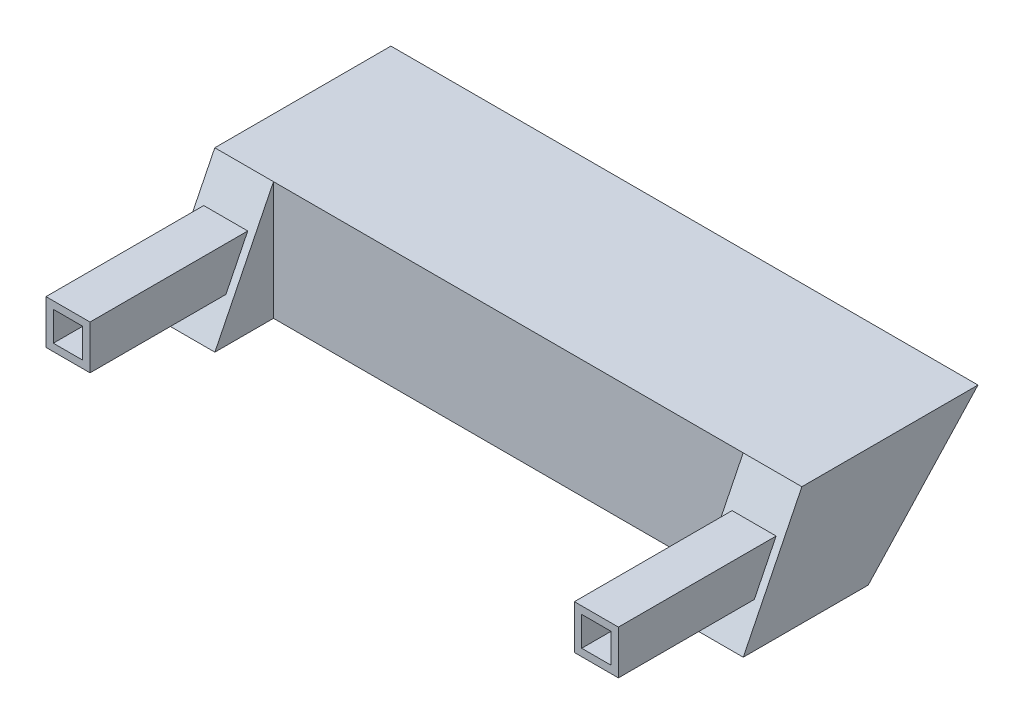
ISO-10303-21;
HEADER;
FILE_DESCRIPTION(('STEP AP214'),'2;1');
FILE_NAME('part.step','',(''),(''),'','','');
FILE_SCHEMA(('AUTOMOTIVE_DESIGN { 1 0 10303 214 1 1 1 1 }'));
ENDSEC;
DATA;
#1=APPLICATION_CONTEXT('core data for automotive mechanical design processes');
#2=APPLICATION_PROTOCOL_DEFINITION('international standard','automotive_design',2000,#1);
#3=PRODUCT_CONTEXT('',#1,'mechanical');
#4=PRODUCT('Part','Part','',(#3));
#5=PRODUCT_RELATED_PRODUCT_CATEGORY('part','',(#4));
#6=PRODUCT_DEFINITION_FORMATION('','',#4);
#7=PRODUCT_DEFINITION_CONTEXT('part definition',#1,'design');
#8=PRODUCT_DEFINITION('design','',#6,#7);
#9=PRODUCT_DEFINITION_SHAPE('','',#8);
#10=(LENGTH_UNIT() NAMED_UNIT(*) SI_UNIT(.MILLI.,.METRE.));
#11=(NAMED_UNIT(*) PLANE_ANGLE_UNIT() SI_UNIT($,.RADIAN.));
#12=(NAMED_UNIT(*) SI_UNIT($,.STERADIAN.) SOLID_ANGLE_UNIT());
#13=UNCERTAINTY_MEASURE_WITH_UNIT(LENGTH_MEASURE(1.E-05),#10,'distance_accuracy_value','');
#14=(GEOMETRIC_REPRESENTATION_CONTEXT(3) GLOBAL_UNCERTAINTY_ASSIGNED_CONTEXT((#13)) GLOBAL_UNIT_ASSIGNED_CONTEXT((#10,
#11,#12)) REPRESENTATION_CONTEXT('',''));
#15=CARTESIAN_POINT('',(0.,0.,0.));
#16=DIRECTION('',(0.,0.,1.));
#17=DIRECTION('',(1.,0.,0.));
#18=AXIS2_PLACEMENT_3D('',#15,#16,#17);
#19=CARTESIAN_POINT('',(127.,51.2148659668265,0.));
#20=DIRECTION('',(0.,-0.443755020837532,-0.896148135902475));
#21=DIRECTION('',(0.,0.896148135902475,-0.443755020837533));
#22=AXIS2_PLACEMENT_3D('',#19,#20,#21);
#23=PLANE('',#22);
#24=DIRECTION('',(0.,-0.896148135902475,0.443755020837532));
#25=VECTOR('',#24,1.);
#26=CARTESIAN_POINT('',(101.6,51.2148659668265,0.));
#27=LINE('',#26,#25);
#28=CARTESIAN_POINT('',(101.6,51.2148659668265,0.));
#29=VERTEX_POINT('',#28);
#30=CARTESIAN_POINT('',(101.6,0.,25.360599440865));
#31=VERTEX_POINT('',#30);
#32=EDGE_CURVE('E361',#29,#31,#27,.T.);
#33=ORIENTED_EDGE('',*,*,#32,.T.);
#34=DIRECTION('',(-1.,0.,0.));
#35=VECTOR('',#34,1.);
#36=CARTESIAN_POINT('',(127.,0.,25.360599440865));
#37=LINE('',#36,#35);
#38=CARTESIAN_POINT('',(127.,0.,25.360599440865));
#39=VERTEX_POINT('',#38);
#40=EDGE_CURVE('E356',#39,#31,#37,.T.);
#41=ORIENTED_EDGE('',*,*,#40,.F.);
#42=DIRECTION('',(0.,-0.896148135902475,0.443755020837532));
#43=VECTOR('',#42,1.);
#44=CARTESIAN_POINT('',(127.,51.2148659668265,0.));
#45=LINE('',#44,#43);
#46=CARTESIAN_POINT('',(127.,51.2148659668265,0.));
#47=VERTEX_POINT('',#46);
#48=EDGE_CURVE('E352',#47,#39,#45,.T.);
#49=ORIENTED_EDGE('',*,*,#48,.F.);
#50=DIRECTION('',(-1.,0.,0.));
#51=VECTOR('',#50,1.);
#52=CARTESIAN_POINT('',(127.,51.2148659668265,0.));
#53=LINE('',#52,#51);
#54=EDGE_CURVE('E395',#47,#29,#53,.T.);
#55=ORIENTED_EDGE('',*,*,#54,.T.);
#56=EDGE_LOOP('',(#33,#41,#49,#55));
#57=FACE_BOUND('',#56,.T.);
#58=DIRECTION('',(0.,-0.896148135902475,0.443755020837533));
#59=VECTOR('',#58,1.);
#60=CARTESIAN_POINT('',(104.775,51.2148659668265,0.));
#61=LINE('',#60,#59);
#62=CARTESIAN_POINT('',(104.775,35.1324329834132,7.96370610812656));
#63=VERTEX_POINT('',#62);
#64=CARTESIAN_POINT('',(104.775,16.0824329834132,17.3968933327384));
#65=VERTEX_POINT('',#64);
#66=EDGE_CURVE('E434',#63,#65,#61,.T.);
#67=ORIENTED_EDGE('',*,*,#66,.F.);
#68=DIRECTION('',(-1.,0.,0.));
#69=VECTOR('',#68,1.);
#70=CARTESIAN_POINT('',(127.,35.1324329834132,7.96370610812653));
#71=LINE('',#70,#69);
#72=CARTESIAN_POINT('',(123.825,35.1324329834132,7.96370610812653));
#73=VERTEX_POINT('',#72);
#74=EDGE_CURVE('E422',#73,#63,#71,.T.);
#75=ORIENTED_EDGE('',*,*,#74,.F.);
#76=DIRECTION('',(0.,0.896148135902475,-0.443755020837533));
#77=VECTOR('',#76,1.);
#78=CARTESIAN_POINT('',(123.825,51.2148659668265,0.));
#79=LINE('',#78,#77);
#80=CARTESIAN_POINT('',(123.825,16.0824329834132,17.3968933327384));
#81=VERTEX_POINT('',#80);
#82=EDGE_CURVE('E426',#81,#73,#79,.T.);
#83=ORIENTED_EDGE('',*,*,#82,.F.);
#84=DIRECTION('',(1.,0.,0.));
#85=VECTOR('',#84,1.);
#86=CARTESIAN_POINT('',(127.,16.0824329834132,17.3968933327384));
#87=LINE('',#86,#85);
#88=EDGE_CURVE('E430',#65,#81,#87,.T.);
#89=ORIENTED_EDGE('',*,*,#88,.F.);
#90=EDGE_LOOP('',(#67,#75,#83,#89));
#91=FACE_BOUND('',#90,.T.);
#92=ADVANCED_FACE('F45',(#57,#91),#23,.F.);
#93=CARTESIAN_POINT('',(127.,0.,0.));
#94=DIRECTION('',(0.,0.,-1.));
#95=DIRECTION('',(-1.,0.,0.));
#96=AXIS2_PLACEMENT_3D('',#93,#94,#95);
#97=PLANE('',#96);
#98=DIRECTION('',(0.,1.,0.));
#99=VECTOR('',#98,1.);
#100=CARTESIAN_POINT('',(-101.6,51.2148659668265,0.));
#101=LINE('',#100,#99);
#102=CARTESIAN_POINT('',(-101.6,0.,0.));
#103=VERTEX_POINT('',#102);
#104=CARTESIAN_POINT('',(-101.6,51.2148659668265,0.));
#105=VERTEX_POINT('',#104);
#106=EDGE_CURVE('E329',#103,#105,#101,.T.);
#107=ORIENTED_EDGE('',*,*,#106,.F.);
#108=DIRECTION('',(-1.,0.,0.));
#109=VECTOR('',#108,1.);
#110=CARTESIAN_POINT('',(127.,0.,0.));
#111=LINE('',#110,#109);
#112=CARTESIAN_POINT('',(101.6,0.,0.));
#113=VERTEX_POINT('',#112);
#114=EDGE_CURVE('E382',#113,#103,#111,.T.);
#115=ORIENTED_EDGE('',*,*,#114,.F.);
#116=DIRECTION('',(0.,1.,0.));
#117=VECTOR('',#116,1.);
#118=CARTESIAN_POINT('',(101.6,51.2148659668265,0.));
#119=LINE('',#118,#117);
#120=EDGE_CURVE('E351',#113,#29,#119,.T.);
#121=ORIENTED_EDGE('',*,*,#120,.T.);
#122=EDGE_CURVE('E394',#29,#105,#53,.T.);
#123=ORIENTED_EDGE('',*,*,#122,.T.);
#124=EDGE_LOOP('',(#107,#115,#121,#123));
#125=FACE_BOUND('',#124,.T.);
#126=ADVANCED_FACE('F485',(#125),#97,.F.);
#127=CARTESIAN_POINT('',(127.,0.,-28.702));
#128=DIRECTION('',(0.,1.,0.));
#129=DIRECTION('',(0.,0.,1.));
#130=AXIS2_PLACEMENT_3D('',#127,#128,#129);
#131=PLANE('',#130);
#132=DIRECTION('',(0.,0.,-1.));
#133=VECTOR('',#132,1.);
#134=CARTESIAN_POINT('',(-127.,0.,-28.702));
#135=LINE('',#134,#133);
#136=CARTESIAN_POINT('',(-127.,0.,25.360599440865));
#137=VERTEX_POINT('',#136);
#138=CARTESIAN_POINT('',(-127.,0.,-28.702));
#139=VERTEX_POINT('',#138);
#140=EDGE_CURVE('E369',#137,#139,#135,.T.);
#141=ORIENTED_EDGE('',*,*,#140,.T.);
#142=DIRECTION('',(-1.,0.,0.));
#143=VECTOR('',#142,1.);
#144=CARTESIAN_POINT('',(127.,0.,-28.702));
#145=LINE('',#144,#143);
#146=CARTESIAN_POINT('',(127.,0.,-28.702));
#147=VERTEX_POINT('',#146);
#148=EDGE_CURVE('E402',#147,#139,#145,.T.);
#149=ORIENTED_EDGE('',*,*,#148,.F.);
#150=DIRECTION('',(0.,0.,-1.));
#151=VECTOR('',#150,1.);
#152=CARTESIAN_POINT('',(127.,0.,-28.702));
#153=LINE('',#152,#151);
#154=EDGE_CURVE('E370',#39,#147,#153,.T.);
#155=ORIENTED_EDGE('',*,*,#154,.F.);
#156=ORIENTED_EDGE('',*,*,#40,.T.);
#157=DIRECTION('',(0.,0.,-1.));
#158=VECTOR('',#157,1.);
#159=CARTESIAN_POINT('',(101.6,0.,25.360599440865));
#160=LINE('',#159,#158);
#161=EDGE_CURVE('E357',#31,#113,#160,.T.);
#162=ORIENTED_EDGE('',*,*,#161,.T.);
#163=ORIENTED_EDGE('',*,*,#114,.T.);
#164=DIRECTION('',(0.,0.,-1.));
#165=VECTOR('',#164,1.);
#166=CARTESIAN_POINT('',(-101.6,0.,25.360599440865));
#167=LINE('',#166,#165);
#168=CARTESIAN_POINT('',(-101.6,0.,25.360599440865));
#169=VERTEX_POINT('',#168);
#170=EDGE_CURVE('E339',#169,#103,#167,.T.);
#171=ORIENTED_EDGE('',*,*,#170,.F.);
#172=DIRECTION('',(1.,0.,0.));
#173=VECTOR('',#172,1.);
#174=CARTESIAN_POINT('',(-127.,0.,25.360599440865));
#175=LINE('',#174,#173);
#176=EDGE_CURVE('E348',#137,#169,#175,.T.);
#177=ORIENTED_EDGE('',*,*,#176,.F.);
#178=EDGE_LOOP('',(#141,#149,#155,#156,#162,#163,#171,#177));
#179=FACE_BOUND('',#178,.T.);
#180=ADVANCED_FACE('F47',(#179),#131,.F.);
#181=CARTESIAN_POINT('',(127.,51.2148659668265,-76.2));
#182=DIRECTION('',(0.,0.68,0.733212111192934));
#183=DIRECTION('',(0.,-0.733212111192934,0.68));
#184=AXIS2_PLACEMENT_3D('',#181,#182,#183);
#185=PLANE('',#184);
#186=DIRECTION('',(0.,0.733212111192934,-0.68));
#187=VECTOR('',#186,1.);
#188=CARTESIAN_POINT('',(-127.,51.2148659668265,-76.2));
#189=LINE('',#188,#187);
#190=CARTESIAN_POINT('',(-127.,51.2148659668265,-76.2));
#191=VERTEX_POINT('',#190);
#192=EDGE_CURVE('E386',#139,#191,#189,.T.);
#193=ORIENTED_EDGE('',*,*,#192,.T.);
#194=DIRECTION('',(-1.,0.,0.));
#195=VECTOR('',#194,1.);
#196=CARTESIAN_POINT('',(127.,51.2148659668265,-76.2));
#197=LINE('',#196,#195);
#198=CARTESIAN_POINT('',(127.,51.2148659668265,-76.2));
#199=VERTEX_POINT('',#198);
#200=EDGE_CURVE('E398',#199,#191,#197,.T.);
#201=ORIENTED_EDGE('',*,*,#200,.F.);
#202=DIRECTION('',(0.,0.733212111192934,-0.68));
#203=VECTOR('',#202,1.);
#204=CARTESIAN_POINT('',(127.,51.2148659668265,-76.2));
#205=LINE('',#204,#203);
#206=EDGE_CURVE('E374',#147,#199,#205,.T.);
#207=ORIENTED_EDGE('',*,*,#206,.F.);
#208=ORIENTED_EDGE('',*,*,#148,.T.);
#209=EDGE_LOOP('',(#193,#201,#207,#208));
#210=FACE_BOUND('',#209,.T.);
#211=ADVANCED_FACE('F504',(#210),#185,.F.);
#212=CARTESIAN_POINT('',(127.,51.2148659668265,0.));
#213=DIRECTION('',(0.,-1.,0.));
#214=DIRECTION('',(0.,0.,-1.));
#215=AXIS2_PLACEMENT_3D('',#212,#213,#214);
#216=PLANE('',#215);
#217=DIRECTION('',(0.,0.,1.));
#218=VECTOR('',#217,1.);
#219=CARTESIAN_POINT('',(-127.,51.2148659668265,0.));
#220=LINE('',#219,#218);
#221=CARTESIAN_POINT('',(-127.,51.2148659668265,0.));
#222=VERTEX_POINT('',#221);
#223=EDGE_CURVE('E375',#191,#222,#220,.T.);
#224=ORIENTED_EDGE('',*,*,#223,.T.);
#225=DIRECTION('',(1.,0.,0.));
#226=VECTOR('',#225,1.);
#227=CARTESIAN_POINT('',(-127.,51.2148659668265,0.));
#228=LINE('',#227,#226);
#229=EDGE_CURVE('E334',#222,#105,#228,.T.);
#230=ORIENTED_EDGE('',*,*,#229,.T.);
#231=ORIENTED_EDGE('',*,*,#122,.F.);
#232=ORIENTED_EDGE('',*,*,#54,.F.);
#233=DIRECTION('',(0.,0.,1.));
#234=VECTOR('',#233,1.);
#235=CARTESIAN_POINT('',(127.,51.2148659668265,0.));
#236=LINE('',#235,#234);
#237=EDGE_CURVE('E378',#199,#47,#236,.T.);
#238=ORIENTED_EDGE('',*,*,#237,.F.);
#239=ORIENTED_EDGE('',*,*,#200,.T.);
#240=EDGE_LOOP('',(#224,#230,#231,#232,#238,#239));
#241=FACE_BOUND('',#240,.T.);
#242=ADVANCED_FACE('F495',(#241),#216,.F.);
#243=CARTESIAN_POINT('',(127.,0.,0.));
#244=DIRECTION('',(-1.,0.,0.));
#245=DIRECTION('',(0.,0.,1.));
#246=AXIS2_PLACEMENT_3D('',#243,#244,#245);
#247=PLANE('',#246);
#248=ORIENTED_EDGE('',*,*,#154,.T.);
#249=ORIENTED_EDGE('',*,*,#206,.T.);
#250=ORIENTED_EDGE('',*,*,#237,.T.);
#251=ORIENTED_EDGE('',*,*,#48,.T.);
#252=EDGE_LOOP('',(#248,#249,#250,#251));
#253=FACE_BOUND('',#252,.T.);
#254=ADVANCED_FACE('F506',(#253),#247,.F.);
#255=CARTESIAN_POINT('',(-127.,0.,0.));
#256=DIRECTION('',(-1.,0.,0.));
#257=DIRECTION('',(0.,0.,1.));
#258=AXIS2_PLACEMENT_3D('',#255,#256,#257);
#259=PLANE('',#258);
#260=ORIENTED_EDGE('',*,*,#140,.F.);
#261=DIRECTION('',(0.,-0.896148135902475,0.443755020837532));
#262=VECTOR('',#261,1.);
#263=CARTESIAN_POINT('',(-127.,51.2148659668265,0.));
#264=LINE('',#263,#262);
#265=EDGE_CURVE('E330',#222,#137,#264,.T.);
#266=ORIENTED_EDGE('',*,*,#265,.F.);
#267=ORIENTED_EDGE('',*,*,#223,.F.);
#268=ORIENTED_EDGE('',*,*,#192,.F.);
#269=EDGE_LOOP('',(#260,#266,#267,#268));
#270=FACE_BOUND('',#269,.T.);
#271=ADVANCED_FACE('F501',(#270),#259,.T.);
#272=CARTESIAN_POINT('',(101.6,0.,0.));
#273=DIRECTION('',(1.,0.,0.));
#274=DIRECTION('',(0.,0.,-1.));
#275=AXIS2_PLACEMENT_3D('',#272,#273,#274);
#276=PLANE('',#275);
#277=ORIENTED_EDGE('',*,*,#120,.F.);
#278=ORIENTED_EDGE('',*,*,#161,.F.);
#279=ORIENTED_EDGE('',*,*,#32,.F.);
#280=EDGE_LOOP('',(#277,#278,#279));
#281=FACE_BOUND('',#280,.T.);
#282=ADVANCED_FACE('F473',(#281),#276,.F.);
#283=CARTESIAN_POINT('',(-127.,51.2148659668265,0.));
#284=DIRECTION('',(0.,0.443755020837532,0.896148135902475));
#285=DIRECTION('',(0.,-0.896148135902475,0.443755020837533));
#286=AXIS2_PLACEMENT_3D('',#283,#284,#285);
#287=PLANE('',#286);
#288=DIRECTION('',(0.,0.896148135902475,-0.443755020837533));
#289=VECTOR('',#288,1.);
#290=CARTESIAN_POINT('',(-104.775,51.2148659668265,0.));
#291=LINE('',#290,#289);
#292=CARTESIAN_POINT('',(-104.775,16.0824329834132,17.3968933327384));
#293=VERTEX_POINT('',#292);
#294=CARTESIAN_POINT('',(-104.775,35.1324329834132,7.96370610812653));
#295=VERTEX_POINT('',#294);
#296=EDGE_CURVE('E11',#293,#295,#291,.T.);
#297=ORIENTED_EDGE('',*,*,#296,.F.);
#298=DIRECTION('',(1.,0.,0.));
#299=VECTOR('',#298,1.);
#300=CARTESIAN_POINT('',(-127.,16.0824329834132,17.3968933327384));
#301=LINE('',#300,#299);
#302=CARTESIAN_POINT('',(-123.825,16.0824329834132,17.3968933327384));
#303=VERTEX_POINT('',#302);
#304=EDGE_CURVE('E451',#303,#293,#301,.T.);
#305=ORIENTED_EDGE('',*,*,#304,.F.);
#306=DIRECTION('',(0.,-0.896148135902475,0.443755020837533));
#307=VECTOR('',#306,1.);
#308=CARTESIAN_POINT('',(-123.825,51.2148659668265,0.));
#309=LINE('',#308,#307);
#310=CARTESIAN_POINT('',(-123.825,35.1324329834132,7.96370610812653));
#311=VERTEX_POINT('',#310);
#312=EDGE_CURVE('E64',#311,#303,#309,.T.);
#313=ORIENTED_EDGE('',*,*,#312,.F.);
#314=DIRECTION('',(-1.,0.,0.));
#315=VECTOR('',#314,1.);
#316=CARTESIAN_POINT('',(-127.,35.1324329834132,7.96370610812653));
#317=LINE('',#316,#315);
#318=EDGE_CURVE('E54',#295,#311,#317,.T.);
#319=ORIENTED_EDGE('',*,*,#318,.F.);
#320=EDGE_LOOP('',(#297,#305,#313,#319));
#321=FACE_BOUND('',#320,.T.);
#322=DIRECTION('',(0.,-0.896148135902475,0.443755020837532));
#323=VECTOR('',#322,1.);
#324=CARTESIAN_POINT('',(-101.6,51.2148659668265,0.));
#325=LINE('',#324,#323);
#326=EDGE_CURVE('E335',#105,#169,#325,.T.);
#327=ORIENTED_EDGE('',*,*,#326,.F.);
#328=ORIENTED_EDGE('',*,*,#229,.F.);
#329=ORIENTED_EDGE('',*,*,#265,.T.);
#330=ORIENTED_EDGE('',*,*,#176,.T.);
#331=EDGE_LOOP('',(#327,#328,#329,#330));
#332=FACE_BOUND('',#331,.T.);
#333=ADVANCED_FACE('F469',(#321,#332),#287,.T.);
#334=CARTESIAN_POINT('',(-101.6,0.,0.));
#335=DIRECTION('',(-1.,0.,0.));
#336=DIRECTION('',(0.,0.,-1.));
#337=AXIS2_PLACEMENT_3D('',#334,#335,#336);
#338=PLANE('',#337);
#339=ORIENTED_EDGE('',*,*,#106,.T.);
#340=ORIENTED_EDGE('',*,*,#326,.T.);
#341=ORIENTED_EDGE('',*,*,#170,.T.);
#342=EDGE_LOOP('',(#339,#340,#341));
#343=FACE_BOUND('',#342,.T.);
#344=ADVANCED_FACE('F472',(#343),#338,.F.);
#345=CARTESIAN_POINT('',(104.775,35.1324329834132,76.2));
#346=DIRECTION('',(1.,0.,0.));
#347=DIRECTION('',(0.,0.,-1.));
#348=AXIS2_PLACEMENT_3D('',#345,#346,#347);
#349=PLANE('',#348);
#350=DIRECTION('',(0.,0.,-1.));
#351=VECTOR('',#350,1.);
#352=CARTESIAN_POINT('',(104.775,35.1324329834132,76.2));
#353=LINE('',#352,#351);
#354=CARTESIAN_POINT('',(104.775,35.1324329834132,76.2));
#355=VERTEX_POINT('',#354);
#356=EDGE_CURVE('E313',#355,#63,#353,.T.);
#357=ORIENTED_EDGE('',*,*,#356,.T.);
#358=ORIENTED_EDGE('',*,*,#66,.T.);
#359=DIRECTION('',(0.,0.,-1.));
#360=VECTOR('',#359,1.);
#361=CARTESIAN_POINT('',(104.775,16.0824329834132,76.2));
#362=LINE('',#361,#360);
#363=CARTESIAN_POINT('',(104.775,16.0824329834132,76.2));
#364=VERTEX_POINT('',#363);
#365=EDGE_CURVE('E325',#364,#65,#362,.T.);
#366=ORIENTED_EDGE('',*,*,#365,.F.);
#367=DIRECTION('',(0.,-1.,0.));
#368=VECTOR('',#367,1.);
#369=CARTESIAN_POINT('',(104.775,35.1324329834132,76.2));
#370=LINE('',#369,#368);
#371=EDGE_CURVE('E300',#355,#364,#370,.T.);
#372=ORIENTED_EDGE('',*,*,#371,.F.);
#373=EDGE_LOOP('',(#357,#358,#366,#372));
#374=FACE_BOUND('',#373,.T.);
#375=ADVANCED_FACE('F520',(#374),#349,.F.);
#376=CARTESIAN_POINT('',(104.775,16.0824329834132,76.2));
#377=DIRECTION('',(0.,1.,0.));
#378=DIRECTION('',(0.,0.,1.));
#379=AXIS2_PLACEMENT_3D('',#376,#377,#378);
#380=PLANE('',#379);
#381=ORIENTED_EDGE('',*,*,#365,.T.);
#382=ORIENTED_EDGE('',*,*,#88,.T.);
#383=DIRECTION('',(0.,0.,-1.));
#384=VECTOR('',#383,1.);
#385=CARTESIAN_POINT('',(123.825,16.0824329834132,76.2));
#386=LINE('',#385,#384);
#387=CARTESIAN_POINT('',(123.825,16.0824329834132,76.2));
#388=VERTEX_POINT('',#387);
#389=EDGE_CURVE('E321',#388,#81,#386,.T.);
#390=ORIENTED_EDGE('',*,*,#389,.F.);
#391=DIRECTION('',(1.,0.,0.));
#392=VECTOR('',#391,1.);
#393=CARTESIAN_POINT('',(104.775,16.0824329834132,76.2));
#394=LINE('',#393,#392);
#395=EDGE_CURVE('E304',#364,#388,#394,.T.);
#396=ORIENTED_EDGE('',*,*,#395,.F.);
#397=EDGE_LOOP('',(#381,#382,#390,#396));
#398=FACE_BOUND('',#397,.T.);
#399=ADVANCED_FACE('F529',(#398),#380,.F.);
#400=CARTESIAN_POINT('',(123.825,35.1324329834132,76.2));
#401=DIRECTION('',(-1.,0.,0.));
#402=DIRECTION('',(0.,0.,1.));
#403=AXIS2_PLACEMENT_3D('',#400,#401,#402);
#404=PLANE('',#403);
#405=ORIENTED_EDGE('',*,*,#389,.T.);
#406=ORIENTED_EDGE('',*,*,#82,.T.);
#407=DIRECTION('',(0.,0.,-1.));
#408=VECTOR('',#407,1.);
#409=CARTESIAN_POINT('',(123.825,35.1324329834132,76.2));
#410=LINE('',#409,#408);
#411=CARTESIAN_POINT('',(123.825,35.1324329834132,76.2));
#412=VERTEX_POINT('',#411);
#413=EDGE_CURVE('E317',#412,#73,#410,.T.);
#414=ORIENTED_EDGE('',*,*,#413,.F.);
#415=DIRECTION('',(0.,1.,0.));
#416=VECTOR('',#415,1.);
#417=CARTESIAN_POINT('',(123.825,35.1324329834132,76.2));
#418=LINE('',#417,#416);
#419=EDGE_CURVE('E307',#388,#412,#418,.T.);
#420=ORIENTED_EDGE('',*,*,#419,.F.);
#421=EDGE_LOOP('',(#405,#406,#414,#420));
#422=FACE_BOUND('',#421,.T.);
#423=ADVANCED_FACE('F527',(#422),#404,.F.);
#424=CARTESIAN_POINT('',(104.775,35.1324329834132,76.2));
#425=DIRECTION('',(0.,-1.,0.));
#426=DIRECTION('',(0.,0.,-1.));
#427=AXIS2_PLACEMENT_3D('',#424,#425,#426);
#428=PLANE('',#427);
#429=ORIENTED_EDGE('',*,*,#413,.T.);
#430=ORIENTED_EDGE('',*,*,#74,.T.);
#431=ORIENTED_EDGE('',*,*,#356,.F.);
#432=DIRECTION('',(-1.,0.,0.));
#433=VECTOR('',#432,1.);
#434=CARTESIAN_POINT('',(104.775,35.1324329834132,76.2));
#435=LINE('',#434,#433);
#436=EDGE_CURVE('E310',#412,#355,#435,.T.);
#437=ORIENTED_EDGE('',*,*,#436,.F.);
#438=EDGE_LOOP('',(#429,#430,#431,#437));
#439=FACE_BOUND('',#438,.T.);
#440=ADVANCED_FACE('F516',(#439),#428,.F.);
#441=CARTESIAN_POINT('',(107.95,31.9574329834132,76.2));
#442=DIRECTION('',(1.,0.,0.));
#443=DIRECTION('',(0.,0.,-1.));
#444=AXIS2_PLACEMENT_3D('',#441,#442,#443);
#445=PLANE('',#444);
#446=DIRECTION('',(0.,-0.896148135902475,0.443755020837533));
#447=VECTOR('',#446,1.);
#448=CARTESIAN_POINT('',(107.95,51.2148659668265,0.));
#449=LINE('',#448,#447);
#450=CARTESIAN_POINT('',(107.95,31.9574329834132,9.53590397889518));
#451=VERTEX_POINT('',#450);
#452=CARTESIAN_POINT('',(107.95,19.2574329834132,15.8246954619698));
#453=VERTEX_POINT('',#452);
#454=EDGE_CURVE('E418',#451,#453,#449,.T.);
#455=ORIENTED_EDGE('',*,*,#454,.F.);
#456=DIRECTION('',(0.,0.,-1.));
#457=VECTOR('',#456,1.);
#458=CARTESIAN_POINT('',(107.95,31.9574329834132,76.2));
#459=LINE('',#458,#457);
#460=CARTESIAN_POINT('',(107.95,31.9574329834132,76.2));
#461=VERTEX_POINT('',#460);
#462=EDGE_CURVE('E285',#461,#451,#459,.T.);
#463=ORIENTED_EDGE('',*,*,#462,.F.);
#464=DIRECTION('',(0.,-1.,0.));
#465=VECTOR('',#464,1.);
#466=CARTESIAN_POINT('',(107.95,31.9574329834132,76.2));
#467=LINE('',#466,#465);
#468=CARTESIAN_POINT('',(107.95,19.2574329834132,76.2));
#469=VERTEX_POINT('',#468);
#470=EDGE_CURVE('E272',#461,#469,#467,.T.);
#471=ORIENTED_EDGE('',*,*,#470,.T.);
#472=DIRECTION('',(0.,0.,-1.));
#473=VECTOR('',#472,1.);
#474=CARTESIAN_POINT('',(107.95,19.2574329834132,76.2));
#475=LINE('',#474,#473);
#476=EDGE_CURVE('E296',#469,#453,#475,.T.);
#477=ORIENTED_EDGE('',*,*,#476,.T.);
#478=EDGE_LOOP('',(#455,#463,#471,#477));
#479=FACE_BOUND('',#478,.T.);
#480=ADVANCED_FACE('F609',(#479),#445,.T.);
#481=CARTESIAN_POINT('',(107.95,19.2574329834132,76.2));
#482=DIRECTION('',(0.,1.,0.));
#483=DIRECTION('',(-1.,0.,0.));
#484=AXIS2_PLACEMENT_3D('',#481,#482,#483);
#485=PLANE('',#484);
#486=DIRECTION('',(1.,0.,0.));
#487=VECTOR('',#486,1.);
#488=CARTESIAN_POINT('',(127.,19.2574329834132,15.8246954619698));
#489=LINE('',#488,#487);
#490=CARTESIAN_POINT('',(120.65,19.2574329834132,15.8246954619698));
#491=VERTEX_POINT('',#490);
#492=EDGE_CURVE('E414',#453,#491,#489,.T.);
#493=ORIENTED_EDGE('',*,*,#492,.F.);
#494=ORIENTED_EDGE('',*,*,#476,.F.);
#495=DIRECTION('',(1.,0.,0.));
#496=VECTOR('',#495,1.);
#497=CARTESIAN_POINT('',(107.95,19.2574329834132,76.2));
#498=LINE('',#497,#496);
#499=CARTESIAN_POINT('',(120.65,19.2574329834132,76.2));
#500=VERTEX_POINT('',#499);
#501=EDGE_CURVE('E275',#469,#500,#498,.T.);
#502=ORIENTED_EDGE('',*,*,#501,.T.);
#503=DIRECTION('',(0.,0.,-1.));
#504=VECTOR('',#503,1.);
#505=CARTESIAN_POINT('',(120.65,19.2574329834132,76.2));
#506=LINE('',#505,#504);
#507=EDGE_CURVE('E292',#500,#491,#506,.T.);
#508=ORIENTED_EDGE('',*,*,#507,.T.);
#509=EDGE_LOOP('',(#493,#494,#502,#508));
#510=FACE_BOUND('',#509,.T.);
#511=ADVANCED_FACE('F617',(#510),#485,.T.);
#512=CARTESIAN_POINT('',(120.65,31.9574329834132,76.2));
#513=DIRECTION('',(-1.,0.,0.));
#514=DIRECTION('',(0.,0.,1.));
#515=AXIS2_PLACEMENT_3D('',#512,#513,#514);
#516=PLANE('',#515);
#517=DIRECTION('',(0.,0.896148135902475,-0.443755020837533));
#518=VECTOR('',#517,1.);
#519=CARTESIAN_POINT('',(120.65,51.2148659668265,0.));
#520=LINE('',#519,#518);
#521=CARTESIAN_POINT('',(120.65,31.9574329834132,9.53590397889521));
#522=VERTEX_POINT('',#521);
#523=EDGE_CURVE('E410',#491,#522,#520,.T.);
#524=ORIENTED_EDGE('',*,*,#523,.F.);
#525=ORIENTED_EDGE('',*,*,#507,.F.);
#526=DIRECTION('',(0.,1.,0.));
#527=VECTOR('',#526,1.);
#528=CARTESIAN_POINT('',(120.65,31.9574329834132,76.2));
#529=LINE('',#528,#527);
#530=CARTESIAN_POINT('',(120.65,31.9574329834132,76.2));
#531=VERTEX_POINT('',#530);
#532=EDGE_CURVE('E278',#500,#531,#529,.T.);
#533=ORIENTED_EDGE('',*,*,#532,.T.);
#534=DIRECTION('',(0.,0.,-1.));
#535=VECTOR('',#534,1.);
#536=CARTESIAN_POINT('',(120.65,31.9574329834132,76.2));
#537=LINE('',#536,#535);
#538=EDGE_CURVE('E288',#531,#522,#537,.T.);
#539=ORIENTED_EDGE('',*,*,#538,.T.);
#540=EDGE_LOOP('',(#524,#525,#533,#539));
#541=FACE_BOUND('',#540,.T.);
#542=ADVANCED_FACE('F627',(#541),#516,.T.);
#543=CARTESIAN_POINT('',(107.95,31.9574329834132,76.2));
#544=DIRECTION('',(0.,-1.,0.));
#545=DIRECTION('',(0.,0.,-1.));
#546=AXIS2_PLACEMENT_3D('',#543,#544,#545);
#547=PLANE('',#546);
#548=DIRECTION('',(-1.,0.,0.));
#549=VECTOR('',#548,1.);
#550=CARTESIAN_POINT('',(127.,31.9574329834132,9.53590397889518));
#551=LINE('',#550,#549);
#552=EDGE_CURVE('E406',#522,#451,#551,.T.);
#553=ORIENTED_EDGE('',*,*,#552,.F.);
#554=ORIENTED_EDGE('',*,*,#538,.F.);
#555=DIRECTION('',(-1.,0.,0.));
#556=VECTOR('',#555,1.);
#557=CARTESIAN_POINT('',(107.95,31.9574329834132,76.2));
#558=LINE('',#557,#556);
#559=EDGE_CURVE('E282',#531,#461,#558,.T.);
#560=ORIENTED_EDGE('',*,*,#559,.T.);
#561=ORIENTED_EDGE('',*,*,#462,.T.);
#562=EDGE_LOOP('',(#553,#554,#560,#561));
#563=FACE_BOUND('',#562,.T.);
#564=ADVANCED_FACE('F637',(#563),#547,.T.);
#565=CARTESIAN_POINT('',(0.,0.,76.2));
#566=DIRECTION('',(0.,0.,1.));
#567=DIRECTION('',(1.,0.,0.));
#568=AXIS2_PLACEMENT_3D('',#565,#566,#567);
#569=PLANE('',#568);
#570=ORIENTED_EDGE('',*,*,#371,.T.);
#571=ORIENTED_EDGE('',*,*,#395,.T.);
#572=ORIENTED_EDGE('',*,*,#419,.T.);
#573=ORIENTED_EDGE('',*,*,#436,.T.);
#574=EDGE_LOOP('',(#570,#571,#572,#573));
#575=FACE_BOUND('',#574,.T.);
#576=ORIENTED_EDGE('',*,*,#501,.F.);
#577=ORIENTED_EDGE('',*,*,#470,.F.);
#578=ORIENTED_EDGE('',*,*,#559,.F.);
#579=ORIENTED_EDGE('',*,*,#532,.F.);
#580=EDGE_LOOP('',(#576,#577,#578,#579));
#581=FACE_BOUND('',#580,.T.);
#582=ADVANCED_FACE('F522',(#575,#581),#569,.T.);
#583=ORIENTED_EDGE('',*,*,#552,.T.);
#584=ORIENTED_EDGE('',*,*,#454,.T.);
#585=ORIENTED_EDGE('',*,*,#492,.T.);
#586=ORIENTED_EDGE('',*,*,#523,.T.);
#587=EDGE_LOOP('',(#583,#584,#585,#586));
#588=FACE_BOUND('',#587,.T.);
#589=ADVANCED_FACE('F511',(#588),#23,.F.);
#590=CARTESIAN_POINT('',(-104.775,35.1324329834132,76.2));
#591=DIRECTION('',(1.,0.,0.));
#592=DIRECTION('',(0.,0.,-1.));
#593=AXIS2_PLACEMENT_3D('',#590,#591,#592);
#594=PLANE('',#593);
#595=DIRECTION('',(0.,0.,-1.));
#596=VECTOR('',#595,1.);
#597=CARTESIAN_POINT('',(-104.775,16.0824329834132,76.2));
#598=LINE('',#597,#596);
#599=CARTESIAN_POINT('',(-104.775,16.0824329834132,76.2));
#600=VERTEX_POINT('',#599);
#601=EDGE_CURVE('E256',#600,#293,#598,.T.);
#602=ORIENTED_EDGE('',*,*,#601,.T.);
#603=ORIENTED_EDGE('',*,*,#296,.T.);
#604=DIRECTION('',(0.,0.,-1.));
#605=VECTOR('',#604,1.);
#606=CARTESIAN_POINT('',(-104.775,35.1324329834132,76.2));
#607=LINE('',#606,#605);
#608=CARTESIAN_POINT('',(-104.775,35.1324329834132,76.2));
#609=VERTEX_POINT('',#608);
#610=EDGE_CURVE('E268',#609,#295,#607,.T.);
#611=ORIENTED_EDGE('',*,*,#610,.F.);
#612=DIRECTION('',(0.,-1.,0.));
#613=VECTOR('',#612,1.);
#614=CARTESIAN_POINT('',(-104.775,35.1324329834132,76.2));
#615=LINE('',#614,#613);
#616=EDGE_CURVE('E210',#609,#600,#615,.T.);
#617=ORIENTED_EDGE('',*,*,#616,.T.);
#618=EDGE_LOOP('',(#602,#603,#611,#617));
#619=FACE_BOUND('',#618,.T.);
#620=ADVANCED_FACE('F468',(#619),#594,.T.);
#621=CARTESIAN_POINT('',(-104.775,35.1324329834132,76.2));
#622=DIRECTION('',(0.,1.,0.));
#623=DIRECTION('',(0.,0.,1.));
#624=AXIS2_PLACEMENT_3D('',#621,#622,#623);
#625=PLANE('',#624);
#626=ORIENTED_EDGE('',*,*,#610,.T.);
#627=ORIENTED_EDGE('',*,*,#318,.T.);
#628=DIRECTION('',(0.,0.,-1.));
#629=VECTOR('',#628,1.);
#630=CARTESIAN_POINT('',(-123.825,35.1324329834132,76.2));
#631=LINE('',#630,#629);
#632=CARTESIAN_POINT('',(-123.825,35.1324329834132,76.2));
#633=VERTEX_POINT('',#632);
#634=EDGE_CURVE('E264',#633,#311,#631,.T.);
#635=ORIENTED_EDGE('',*,*,#634,.F.);
#636=DIRECTION('',(1.,0.,0.));
#637=VECTOR('',#636,1.);
#638=CARTESIAN_POINT('',(-104.775,35.1324329834132,76.2));
#639=LINE('',#638,#637);
#640=EDGE_CURVE('E244',#633,#609,#639,.T.);
#641=ORIENTED_EDGE('',*,*,#640,.T.);
#642=EDGE_LOOP('',(#626,#627,#635,#641));
#643=FACE_BOUND('',#642,.T.);
#644=ADVANCED_FACE('F458',(#643),#625,.T.);
#645=CARTESIAN_POINT('',(-123.825,35.1324329834132,76.2));
#646=DIRECTION('',(-1.,0.,0.));
#647=DIRECTION('',(0.,0.,1.));
#648=AXIS2_PLACEMENT_3D('',#645,#646,#647);
#649=PLANE('',#648);
#650=ORIENTED_EDGE('',*,*,#634,.T.);
#651=ORIENTED_EDGE('',*,*,#312,.T.);
#652=DIRECTION('',(0.,0.,-1.));
#653=VECTOR('',#652,1.);
#654=CARTESIAN_POINT('',(-123.825,16.0824329834132,76.2));
#655=LINE('',#654,#653);
#656=CARTESIAN_POINT('',(-123.825,16.0824329834132,76.2));
#657=VERTEX_POINT('',#656);
#658=EDGE_CURVE('E260',#657,#303,#655,.T.);
#659=ORIENTED_EDGE('',*,*,#658,.F.);
#660=DIRECTION('',(0.,1.,0.));
#661=VECTOR('',#660,1.);
#662=CARTESIAN_POINT('',(-123.825,35.1324329834132,76.2));
#663=LINE('',#662,#661);
#664=EDGE_CURVE('E248',#657,#633,#663,.T.);
#665=ORIENTED_EDGE('',*,*,#664,.T.);
#666=EDGE_LOOP('',(#650,#651,#659,#665));
#667=FACE_BOUND('',#666,.T.);
#668=ADVANCED_FACE('F461',(#667),#649,.T.);
#669=CARTESIAN_POINT('',(-104.775,16.0824329834132,76.2));
#670=DIRECTION('',(0.,-1.,0.));
#671=DIRECTION('',(0.,0.,-1.));
#672=AXIS2_PLACEMENT_3D('',#669,#670,#671);
#673=PLANE('',#672);
#674=ORIENTED_EDGE('',*,*,#658,.T.);
#675=ORIENTED_EDGE('',*,*,#304,.T.);
#676=ORIENTED_EDGE('',*,*,#601,.F.);
#677=DIRECTION('',(-1.,0.,0.));
#678=VECTOR('',#677,1.);
#679=CARTESIAN_POINT('',(-104.775,16.0824329834132,76.2));
#680=LINE('',#679,#678);
#681=EDGE_CURVE('E252',#600,#657,#680,.T.);
#682=ORIENTED_EDGE('',*,*,#681,.T.);
#683=EDGE_LOOP('',(#674,#675,#676,#682));
#684=FACE_BOUND('',#683,.T.);
#685=ADVANCED_FACE('F466',(#684),#673,.T.);
#686=CARTESIAN_POINT('',(0.,0.,76.2));
#687=DIRECTION('',(0.,0.,1.));
#688=DIRECTION('',(-1.,0.,0.));
#689=AXIS2_PLACEMENT_3D('',#686,#687,#688);
#690=PLANE('',#689);
#691=DIRECTION('',(0.,-1.,0.));
#692=VECTOR('',#691,1.);
#693=CARTESIAN_POINT('',(-107.95,31.9574329834132,76.2));
#694=LINE('',#693,#692);
#695=CARTESIAN_POINT('',(-107.95,31.9574329834132,76.2));
#696=VERTEX_POINT('',#695);
#697=CARTESIAN_POINT('',(-107.95,19.2574329834132,76.2));
#698=VERTEX_POINT('',#697);
#699=EDGE_CURVE('E214',#696,#698,#694,.T.);
#700=ORIENTED_EDGE('',*,*,#699,.T.);
#701=DIRECTION('',(-1.,0.,0.));
#702=VECTOR('',#701,1.);
#703=CARTESIAN_POINT('',(-107.95,19.2574329834132,76.2));
#704=LINE('',#703,#702);
#705=CARTESIAN_POINT('',(-120.65,19.2574329834132,76.2));
#706=VERTEX_POINT('',#705);
#707=EDGE_CURVE('E228',#698,#706,#704,.T.);
#708=ORIENTED_EDGE('',*,*,#707,.T.);
#709=DIRECTION('',(0.,1.,0.));
#710=VECTOR('',#709,1.);
#711=CARTESIAN_POINT('',(-120.65,31.9574329834132,76.2));
#712=LINE('',#711,#710);
#713=CARTESIAN_POINT('',(-120.65,31.9574329834132,76.2));
#714=VERTEX_POINT('',#713);
#715=EDGE_CURVE('E224',#706,#714,#712,.T.);
#716=ORIENTED_EDGE('',*,*,#715,.T.);
#717=DIRECTION('',(1.,0.,0.));
#718=VECTOR('',#717,1.);
#719=CARTESIAN_POINT('',(-107.95,31.9574329834132,76.2));
#720=LINE('',#719,#718);
#721=EDGE_CURVE('E202',#714,#696,#720,.T.);
#722=ORIENTED_EDGE('',*,*,#721,.T.);
#723=EDGE_LOOP('',(#700,#708,#716,#722));
#724=FACE_BOUND('',#723,.T.);
#725=ORIENTED_EDGE('',*,*,#616,.F.);
#726=ORIENTED_EDGE('',*,*,#640,.F.);
#727=ORIENTED_EDGE('',*,*,#664,.F.);
#728=ORIENTED_EDGE('',*,*,#681,.F.);
#729=EDGE_LOOP('',(#725,#726,#727,#728));
#730=FACE_BOUND('',#729,.T.);
#731=ADVANCED_FACE('F222',(#724,#730),#690,.T.);
#732=CARTESIAN_POINT('',(-107.95,31.9574329834132,76.2));
#733=DIRECTION('',(1.,0.,0.));
#734=DIRECTION('',(0.,0.,-1.));
#735=AXIS2_PLACEMENT_3D('',#732,#733,#734);
#736=PLANE('',#735);
#737=DIRECTION('',(0.,0.896148135902475,-0.443755020837533));
#738=VECTOR('',#737,1.);
#739=CARTESIAN_POINT('',(-107.95,51.2148659668265,0.));
#740=LINE('',#739,#738);
#741=CARTESIAN_POINT('',(-107.95,19.2574329834132,15.8246954619698));
#742=VERTEX_POINT('',#741);
#743=CARTESIAN_POINT('',(-107.95,31.9574329834132,9.53590397889521));
#744=VERTEX_POINT('',#743);
#745=EDGE_CURVE('E448',#742,#744,#740,.T.);
#746=ORIENTED_EDGE('',*,*,#745,.F.);
#747=DIRECTION('',(0.,0.,-1.));
#748=VECTOR('',#747,1.);
#749=CARTESIAN_POINT('',(-107.95,19.2574329834132,76.2));
#750=LINE('',#749,#748);
#751=EDGE_CURVE('E216',#698,#742,#750,.T.);
#752=ORIENTED_EDGE('',*,*,#751,.F.);
#753=ORIENTED_EDGE('',*,*,#699,.F.);
#754=DIRECTION('',(0.,0.,-1.));
#755=VECTOR('',#754,1.);
#756=CARTESIAN_POINT('',(-107.95,31.9574329834132,76.2));
#757=LINE('',#756,#755);
#758=EDGE_CURVE('E197',#696,#744,#757,.T.);
#759=ORIENTED_EDGE('',*,*,#758,.T.);
#760=EDGE_LOOP('',(#746,#752,#753,#759));
#761=FACE_BOUND('',#760,.T.);
#762=ADVANCED_FACE('F215',(#761),#736,.F.);
#763=CARTESIAN_POINT('',(-107.95,31.9574329834132,76.2));
#764=DIRECTION('',(0.,1.,0.));
#765=DIRECTION('',(0.,0.,1.));
#766=AXIS2_PLACEMENT_3D('',#763,#764,#765);
#767=PLANE('',#766);
#768=DIRECTION('',(-1.,0.,0.));
#769=VECTOR('',#768,1.);
#770=CARTESIAN_POINT('',(-127.,31.9574329834132,9.53590397889518));
#771=LINE('',#770,#769);
#772=CARTESIAN_POINT('',(-120.65,31.9574329834132,9.53590397889521));
#773=VERTEX_POINT('',#772);
#774=EDGE_CURVE('E205',#744,#773,#771,.T.);
#775=ORIENTED_EDGE('',*,*,#774,.F.);
#776=ORIENTED_EDGE('',*,*,#758,.F.);
#777=ORIENTED_EDGE('',*,*,#721,.F.);
#778=DIRECTION('',(0.,0.,-1.));
#779=VECTOR('',#778,1.);
#780=CARTESIAN_POINT('',(-120.65,31.9574329834132,76.2));
#781=LINE('',#780,#779);
#782=EDGE_CURVE('E211',#714,#773,#781,.T.);
#783=ORIENTED_EDGE('',*,*,#782,.T.);
#784=EDGE_LOOP('',(#775,#776,#777,#783));
#785=FACE_BOUND('',#784,.T.);
#786=ADVANCED_FACE('F199',(#785),#767,.F.);
#787=CARTESIAN_POINT('',(-120.65,31.9574329834132,76.2));
#788=DIRECTION('',(-1.,0.,0.));
#789=DIRECTION('',(0.,0.,1.));
#790=AXIS2_PLACEMENT_3D('',#787,#788,#789);
#791=PLANE('',#790);
#792=DIRECTION('',(0.,-0.896148135902475,0.443755020837533));
#793=VECTOR('',#792,1.);
#794=CARTESIAN_POINT('',(-120.65,51.2148659668265,0.));
#795=LINE('',#794,#793);
#796=CARTESIAN_POINT('',(-120.65,19.2574329834132,15.8246954619698));
#797=VERTEX_POINT('',#796);
#798=EDGE_CURVE('E442',#773,#797,#795,.T.);
#799=ORIENTED_EDGE('',*,*,#798,.F.);
#800=ORIENTED_EDGE('',*,*,#782,.F.);
#801=ORIENTED_EDGE('',*,*,#715,.F.);
#802=DIRECTION('',(0.,0.,-1.));
#803=VECTOR('',#802,1.);
#804=CARTESIAN_POINT('',(-120.65,19.2574329834132,76.2));
#805=LINE('',#804,#803);
#806=EDGE_CURVE('E235',#706,#797,#805,.T.);
#807=ORIENTED_EDGE('',*,*,#806,.T.);
#808=EDGE_LOOP('',(#799,#800,#801,#807));
#809=FACE_BOUND('',#808,.T.);
#810=ADVANCED_FACE('F720',(#809),#791,.F.);
#811=CARTESIAN_POINT('',(-107.95,19.2574329834132,76.2));
#812=DIRECTION('',(0.,-1.,0.));
#813=DIRECTION('',(1.,0.,0.));
#814=AXIS2_PLACEMENT_3D('',#811,#812,#813);
#815=PLANE('',#814);
#816=DIRECTION('',(1.,0.,0.));
#817=VECTOR('',#816,1.);
#818=CARTESIAN_POINT('',(-127.,19.2574329834132,15.8246954619698));
#819=LINE('',#818,#817);
#820=EDGE_CURVE('E438',#797,#742,#819,.T.);
#821=ORIENTED_EDGE('',*,*,#820,.F.);
#822=ORIENTED_EDGE('',*,*,#806,.F.);
#823=ORIENTED_EDGE('',*,*,#707,.F.);
#824=ORIENTED_EDGE('',*,*,#751,.T.);
#825=EDGE_LOOP('',(#821,#822,#823,#824));
#826=FACE_BOUND('',#825,.T.);
#827=ADVANCED_FACE('F664',(#826),#815,.F.);
#828=ORIENTED_EDGE('',*,*,#820,.T.);
#829=ORIENTED_EDGE('',*,*,#745,.T.);
#830=ORIENTED_EDGE('',*,*,#774,.T.);
#831=ORIENTED_EDGE('',*,*,#798,.T.);
#832=EDGE_LOOP('',(#828,#829,#830,#831));
#833=FACE_BOUND('',#832,.T.);
#834=ADVANCED_FACE('F475',(#833),#287,.T.);
#835=CLOSED_SHELL('',(#92,#126,#180,#211,#242,#254,#271,#282,#333,#344,#375,#399,#423,#440,#480,
#511,#542,#564,#582,#589,#620,#644,#668,#685,#731,#762,#786,#810,#827,#834));
#836=MANIFOLD_SOLID_BREP('B2',#835);
#837=ADVANCED_BREP_SHAPE_REPRESENTATION('',(#18,#836),#14);
#838=SHAPE_DEFINITION_REPRESENTATION(#9,#837);
ENDSEC;
END-ISO-10303-21;
